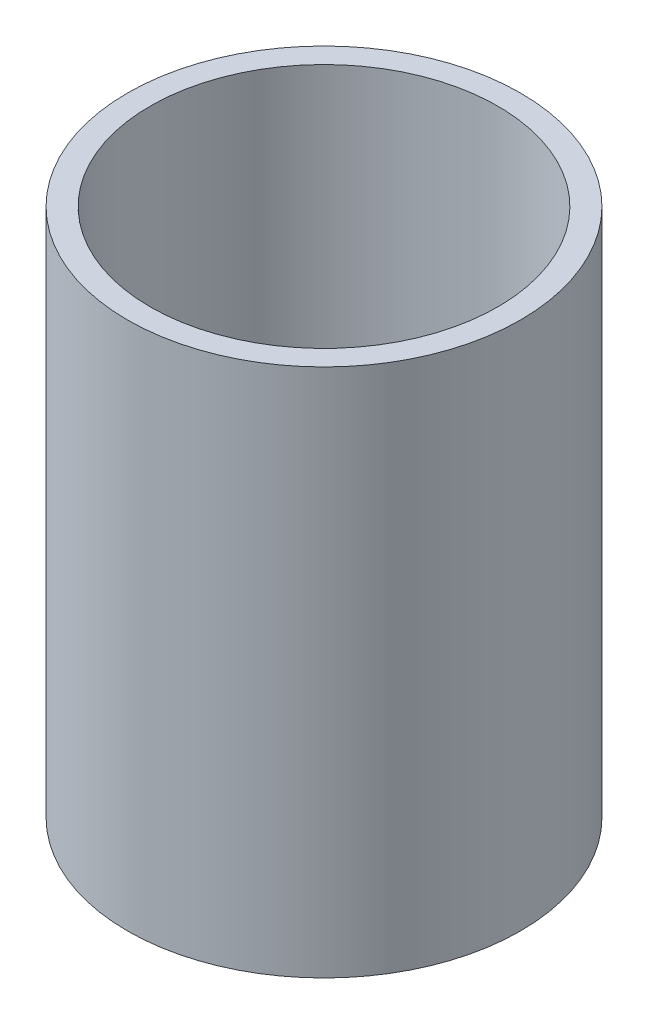
ISO-10303-21;
HEADER;
FILE_DESCRIPTION(('STEP AP214'),'2;1');
FILE_NAME('part.step','',(''),(''),'','','');
FILE_SCHEMA(('AUTOMOTIVE_DESIGN { 1 0 10303 214 1 1 1 1 }'));
ENDSEC;
DATA;
#1=APPLICATION_CONTEXT('core data for automotive mechanical design processes');
#2=APPLICATION_PROTOCOL_DEFINITION('international standard','automotive_design',2000,#1);
#3=PRODUCT_CONTEXT('',#1,'mechanical');
#4=PRODUCT('Part','Part','',(#3));
#5=PRODUCT_RELATED_PRODUCT_CATEGORY('part','',(#4));
#6=PRODUCT_DEFINITION_FORMATION('','',#4);
#7=PRODUCT_DEFINITION_CONTEXT('part definition',#1,'design');
#8=PRODUCT_DEFINITION('design','',#6,#7);
#9=PRODUCT_DEFINITION_SHAPE('','',#8);
#10=(LENGTH_UNIT() NAMED_UNIT(*) SI_UNIT(.MILLI.,.METRE.));
#11=(NAMED_UNIT(*) PLANE_ANGLE_UNIT() SI_UNIT($,.RADIAN.));
#12=(NAMED_UNIT(*) SI_UNIT($,.STERADIAN.) SOLID_ANGLE_UNIT());
#13=UNCERTAINTY_MEASURE_WITH_UNIT(LENGTH_MEASURE(1.E-05),#10,'distance_accuracy_value','');
#14=(GEOMETRIC_REPRESENTATION_CONTEXT(3) GLOBAL_UNCERTAINTY_ASSIGNED_CONTEXT((#13)) GLOBAL_UNIT_ASSIGNED_CONTEXT((#10,
#11,#12)) REPRESENTATION_CONTEXT('',''));
#15=CARTESIAN_POINT('',(0.,0.,0.));
#16=DIRECTION('',(0.,0.,1.));
#17=DIRECTION('',(1.,0.,0.));
#18=AXIS2_PLACEMENT_3D('',#15,#16,#17);
#19=CARTESIAN_POINT('',(0.,35.,0.));
#20=DIRECTION('',(0.,-1.,0.));
#21=DIRECTION('',(0.,0.,-1.));
#22=AXIS2_PLACEMENT_3D('',#19,#20,#21);
#23=CYLINDRICAL_SURFACE('',#22,23.);
#24=CARTESIAN_POINT('',(0.,35.,0.));
#25=DIRECTION('',(0.,1.,0.));
#26=DIRECTION('',(0.,0.,1.));
#27=AXIS2_PLACEMENT_3D('',#24,#25,#26);
#28=CIRCLE('',#27,23.);
#29=CARTESIAN_POINT('',(0.,35.,23.));
#30=VERTEX_POINT('',#29);
#31=EDGE_CURVE('E44',#30,#30,#28,.T.);
#32=ORIENTED_EDGE('',*,*,#31,.T.);
#33=EDGE_LOOP('',(#32));
#34=FACE_BOUND('',#33,.T.);
#35=CARTESIAN_POINT('',(0.,-35.,0.));
#36=DIRECTION('',(0.,1.,0.));
#37=DIRECTION('',(0.,0.,1.));
#38=AXIS2_PLACEMENT_3D('',#35,#36,#37);
#39=CIRCLE('',#38,23.);
#40=CARTESIAN_POINT('',(0.,-35.,23.));
#41=VERTEX_POINT('',#40);
#42=EDGE_CURVE('E52',#41,#41,#39,.T.);
#43=ORIENTED_EDGE('',*,*,#42,.F.);
#44=EDGE_LOOP('',(#43));
#45=FACE_BOUND('',#44,.T.);
#46=ADVANCED_FACE('F36',(#34,#45),#23,.F.);
#47=CARTESIAN_POINT('',(0.,35.,0.));
#48=DIRECTION('',(0.,-1.,0.));
#49=DIRECTION('',(0.,0.,-1.));
#50=AXIS2_PLACEMENT_3D('',#47,#48,#49);
#51=CYLINDRICAL_SURFACE('',#50,26.);
#52=CARTESIAN_POINT('',(0.,35.,0.));
#53=DIRECTION('',(0.,1.,0.));
#54=DIRECTION('',(0.,0.,1.));
#55=AXIS2_PLACEMENT_3D('',#52,#53,#54);
#56=CIRCLE('',#55,26.);
#57=CARTESIAN_POINT('',(0.,35.,26.));
#58=VERTEX_POINT('',#57);
#59=EDGE_CURVE('E10',#58,#58,#56,.T.);
#60=ORIENTED_EDGE('',*,*,#59,.F.);
#61=EDGE_LOOP('',(#60));
#62=FACE_BOUND('',#61,.T.);
#63=CARTESIAN_POINT('',(0.,-35.,0.));
#64=DIRECTION('',(0.,1.,0.));
#65=DIRECTION('',(0.,0.,1.));
#66=AXIS2_PLACEMENT_3D('',#63,#64,#65);
#67=CIRCLE('',#66,26.);
#68=CARTESIAN_POINT('',(0.,-35.,26.));
#69=VERTEX_POINT('',#68);
#70=EDGE_CURVE('E39',#69,#69,#67,.T.);
#71=ORIENTED_EDGE('',*,*,#70,.T.);
#72=EDGE_LOOP('',(#71));
#73=FACE_BOUND('',#72,.T.);
#74=ADVANCED_FACE('F63',(#62,#73),#51,.T.);
#75=CARTESIAN_POINT('',(0.,35.,0.));
#76=DIRECTION('',(0.,1.,0.));
#77=DIRECTION('',(0.,0.,1.));
#78=AXIS2_PLACEMENT_3D('',#75,#76,#77);
#79=PLANE('',#78);
#80=ORIENTED_EDGE('',*,*,#31,.F.);
#81=EDGE_LOOP('',(#80));
#82=FACE_BOUND('',#81,.T.);
#83=ORIENTED_EDGE('',*,*,#59,.T.);
#84=EDGE_LOOP('',(#83));
#85=FACE_BOUND('',#84,.T.);
#86=ADVANCED_FACE('F67',(#82,#85),#79,.T.);
#87=CARTESIAN_POINT('',(0.,-35.,0.));
#88=DIRECTION('',(0.,1.,0.));
#89=DIRECTION('',(0.,0.,1.));
#90=AXIS2_PLACEMENT_3D('',#87,#88,#89);
#91=PLANE('',#90);
#92=ORIENTED_EDGE('',*,*,#42,.T.);
#93=EDGE_LOOP('',(#92));
#94=FACE_BOUND('',#93,.T.);
#95=ORIENTED_EDGE('',*,*,#70,.F.);
#96=EDGE_LOOP('',(#95));
#97=FACE_BOUND('',#96,.T.);
#98=ADVANCED_FACE('F65',(#94,#97),#91,.F.);
#99=CLOSED_SHELL('',(#46,#74,#86,#98));
#100=MANIFOLD_SOLID_BREP('B2',#99);
#101=ADVANCED_BREP_SHAPE_REPRESENTATION('',(#18,#100),#14);
#102=SHAPE_DEFINITION_REPRESENTATION(#9,#101);
ENDSEC;
END-ISO-10303-21;
